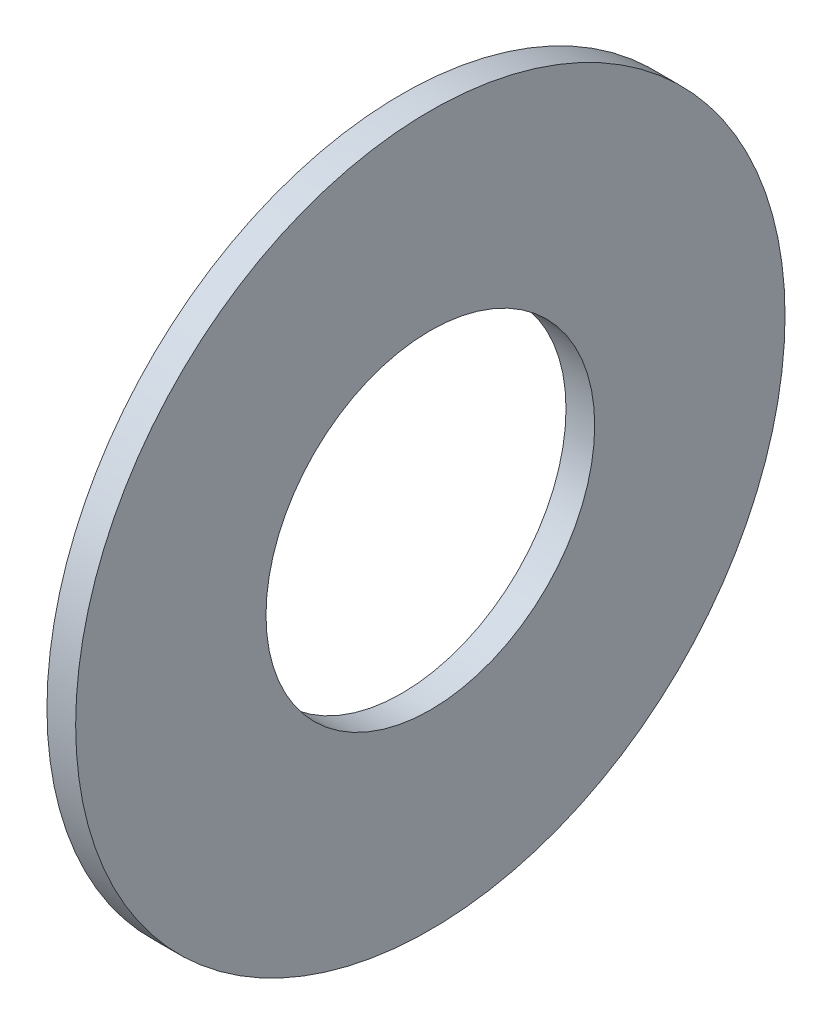
ISO-10303-21;
HEADER;
FILE_DESCRIPTION(('STEP AP214'),'2;1');
FILE_NAME('part.step','',(''),(''),'','','');
FILE_SCHEMA(('AUTOMOTIVE_DESIGN { 1 0 10303 214 1 1 1 1 }'));
ENDSEC;
DATA;
#1=APPLICATION_CONTEXT('core data for automotive mechanical design processes');
#2=APPLICATION_PROTOCOL_DEFINITION('international standard','automotive_design',2000,#1);
#3=PRODUCT_CONTEXT('',#1,'mechanical');
#4=PRODUCT('Part','Part','',(#3));
#5=PRODUCT_RELATED_PRODUCT_CATEGORY('part','',(#4));
#6=PRODUCT_DEFINITION_FORMATION('','',#4);
#7=PRODUCT_DEFINITION_CONTEXT('part definition',#1,'design');
#8=PRODUCT_DEFINITION('design','',#6,#7);
#9=PRODUCT_DEFINITION_SHAPE('','',#8);
#10=(LENGTH_UNIT() NAMED_UNIT(*) SI_UNIT(.MILLI.,.METRE.));
#11=(NAMED_UNIT(*) PLANE_ANGLE_UNIT() SI_UNIT($,.RADIAN.));
#12=(NAMED_UNIT(*) SI_UNIT($,.STERADIAN.) SOLID_ANGLE_UNIT());
#13=UNCERTAINTY_MEASURE_WITH_UNIT(LENGTH_MEASURE(1.E-05),#10,'distance_accuracy_value','');
#14=(GEOMETRIC_REPRESENTATION_CONTEXT(3) GLOBAL_UNCERTAINTY_ASSIGNED_CONTEXT((#13)) GLOBAL_UNIT_ASSIGNED_CONTEXT((#10,
#11,#12)) REPRESENTATION_CONTEXT('',''));
#15=CARTESIAN_POINT('',(0.,0.,0.));
#16=DIRECTION('',(0.,0.,1.));
#17=DIRECTION('',(1.,0.,0.));
#18=AXIS2_PLACEMENT_3D('',#15,#16,#17);
#19=CARTESIAN_POINT('',(-34.9249999999999,0.,0.));
#20=DIRECTION('',(-1.,0.,0.));
#21=DIRECTION('',(0.,0.,1.));
#22=AXIS2_PLACEMENT_3D('',#19,#20,#21);
#23=CYLINDRICAL_SURFACE('',#22,26.1874);
#24=CARTESIAN_POINT('',(0.,0.,0.));
#25=DIRECTION('',(-1.,0.,0.));
#26=DIRECTION('',(0.,0.,1.));
#27=AXIS2_PLACEMENT_3D('',#24,#25,#26);
#28=CIRCLE('',#27,26.1874);
#29=CARTESIAN_POINT('',(0.,0.,26.1874));
#30=VERTEX_POINT('',#29);
#31=EDGE_CURVE('E10',#30,#30,#28,.T.);
#32=ORIENTED_EDGE('',*,*,#31,.F.);
#33=EDGE_LOOP('',(#32));
#34=FACE_BOUND('',#33,.T.);
#35=CARTESIAN_POINT('',(-4.572,0.,0.));
#36=DIRECTION('',(-1.,0.,0.));
#37=DIRECTION('',(0.,0.,1.));
#38=AXIS2_PLACEMENT_3D('',#35,#36,#37);
#39=CIRCLE('',#38,26.1874);
#40=CARTESIAN_POINT('',(-4.572,0.,26.1874));
#41=VERTEX_POINT('',#40);
#42=EDGE_CURVE('E44',#41,#41,#39,.T.);
#43=ORIENTED_EDGE('',*,*,#42,.T.);
#44=EDGE_LOOP('',(#43));
#45=FACE_BOUND('',#44,.T.);
#46=ADVANCED_FACE('F30',(#34,#45),#23,.F.);
#47=CARTESIAN_POINT('',(0.,26.1874,0.));
#48=DIRECTION('',(-1.,0.,0.));
#49=DIRECTION('',(0.,0.,1.));
#50=AXIS2_PLACEMENT_3D('',#47,#48,#49);
#51=PLANE('',#50);
#52=CARTESIAN_POINT('',(0.,0.,0.));
#53=DIRECTION('',(-1.,0.,0.));
#54=DIRECTION('',(0.,0.,1.));
#55=AXIS2_PLACEMENT_3D('',#52,#53,#54);
#56=CIRCLE('',#55,56.515);
#57=CARTESIAN_POINT('',(0.,0.,56.515));
#58=VERTEX_POINT('',#57);
#59=EDGE_CURVE('E36',#58,#58,#56,.T.);
#60=ORIENTED_EDGE('',*,*,#59,.F.);
#61=EDGE_LOOP('',(#60));
#62=FACE_BOUND('',#61,.T.);
#63=ORIENTED_EDGE('',*,*,#31,.T.);
#64=EDGE_LOOP('',(#63));
#65=FACE_BOUND('',#64,.T.);
#66=ADVANCED_FACE('F59',(#62,#65),#51,.F.);
#67=CARTESIAN_POINT('',(-34.9249999999999,0.,0.));
#68=DIRECTION('',(-1.,0.,0.));
#69=DIRECTION('',(0.,0.,1.));
#70=AXIS2_PLACEMENT_3D('',#67,#68,#69);
#71=CYLINDRICAL_SURFACE('',#70,56.515);
#72=CARTESIAN_POINT('',(-4.572,0.,0.));
#73=DIRECTION('',(-1.,0.,0.));
#74=DIRECTION('',(0.,0.,1.));
#75=AXIS2_PLACEMENT_3D('',#72,#73,#74);
#76=CIRCLE('',#75,56.515);
#77=CARTESIAN_POINT('',(-4.572,0.,56.515));
#78=VERTEX_POINT('',#77);
#79=EDGE_CURVE('E40',#78,#78,#76,.T.);
#80=ORIENTED_EDGE('',*,*,#79,.F.);
#81=EDGE_LOOP('',(#80));
#82=FACE_BOUND('',#81,.T.);
#83=ORIENTED_EDGE('',*,*,#59,.T.);
#84=EDGE_LOOP('',(#83));
#85=FACE_BOUND('',#84,.T.);
#86=ADVANCED_FACE('F54',(#82,#85),#71,.T.);
#87=CARTESIAN_POINT('',(-4.572,56.515,0.));
#88=DIRECTION('',(1.,0.,0.));
#89=DIRECTION('',(0.,0.,-1.));
#90=AXIS2_PLACEMENT_3D('',#87,#88,#89);
#91=PLANE('',#90);
#92=ORIENTED_EDGE('',*,*,#42,.F.);
#93=EDGE_LOOP('',(#92));
#94=FACE_BOUND('',#93,.T.);
#95=ORIENTED_EDGE('',*,*,#79,.T.);
#96=EDGE_LOOP('',(#95));
#97=FACE_BOUND('',#96,.T.);
#98=ADVANCED_FACE('F51',(#94,#97),#91,.F.);
#99=CLOSED_SHELL('',(#46,#66,#86,#98));
#100=MANIFOLD_SOLID_BREP('B2',#99);
#101=ADVANCED_BREP_SHAPE_REPRESENTATION('',(#18,#100),#14);
#102=SHAPE_DEFINITION_REPRESENTATION(#9,#101);
ENDSEC;
END-ISO-10303-21;
